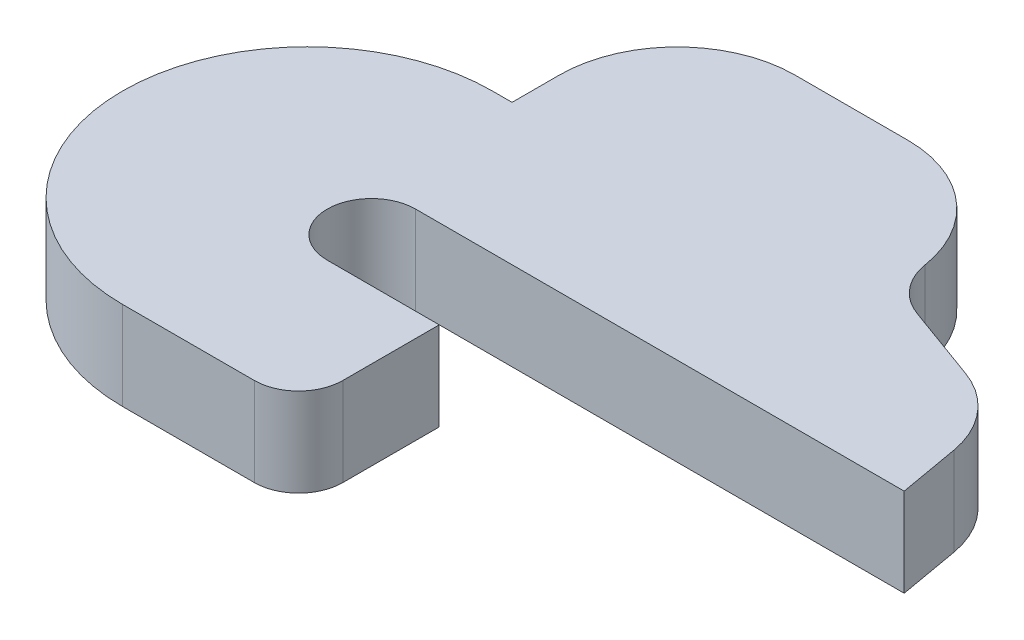
ISO-10303-21;
HEADER;
FILE_DESCRIPTION(('STEP AP214'),'2;1');
FILE_NAME('part.step','',(''),(''),'','','');
FILE_SCHEMA(('AUTOMOTIVE_DESIGN { 1 0 10303 214 1 1 1 1 }'));
ENDSEC;
DATA;
#1=APPLICATION_CONTEXT('core data for automotive mechanical design processes');
#2=APPLICATION_PROTOCOL_DEFINITION('international standard','automotive_design',2000,#1);
#3=PRODUCT_CONTEXT('',#1,'mechanical');
#4=PRODUCT('Part','Part','',(#3));
#5=PRODUCT_RELATED_PRODUCT_CATEGORY('part','',(#4));
#6=PRODUCT_DEFINITION_FORMATION('','',#4);
#7=PRODUCT_DEFINITION_CONTEXT('part definition',#1,'design');
#8=PRODUCT_DEFINITION('design','',#6,#7);
#9=PRODUCT_DEFINITION_SHAPE('','',#8);
#10=(LENGTH_UNIT() NAMED_UNIT(*) SI_UNIT(.MILLI.,.METRE.));
#11=(NAMED_UNIT(*) PLANE_ANGLE_UNIT() SI_UNIT($,.RADIAN.));
#12=(NAMED_UNIT(*) SI_UNIT($,.STERADIAN.) SOLID_ANGLE_UNIT());
#13=UNCERTAINTY_MEASURE_WITH_UNIT(LENGTH_MEASURE(1.E-05),#10,'distance_accuracy_value','');
#14=(GEOMETRIC_REPRESENTATION_CONTEXT(3) GLOBAL_UNCERTAINTY_ASSIGNED_CONTEXT((#13)) GLOBAL_UNIT_ASSIGNED_CONTEXT((#10,
#11,#12)) REPRESENTATION_CONTEXT('',''));
#15=CARTESIAN_POINT('',(0.,0.,0.));
#16=DIRECTION('',(0.,0.,1.));
#17=DIRECTION('',(1.,0.,0.));
#18=AXIS2_PLACEMENT_3D('',#15,#16,#17);
#19=CARTESIAN_POINT('',(0.,3.,3.27));
#20=DIRECTION('',(-1.,0.,0.));
#21=DIRECTION('',(0.,0.,1.));
#22=AXIS2_PLACEMENT_3D('',#19,#20,#21);
#23=PLANE('',#22);
#24=DIRECTION('',(0.,0.,-1.));
#25=VECTOR('',#24,1.);
#26=CARTESIAN_POINT('',(0.,0.,3.27));
#27=LINE('',#26,#25);
#28=CARTESIAN_POINT('',(0.,0.,3.27));
#29=VERTEX_POINT('',#28);
#30=CARTESIAN_POINT('',(0.,0.,0.));
#31=VERTEX_POINT('',#30);
#32=EDGE_CURVE('E177',#29,#31,#27,.T.);
#33=ORIENTED_EDGE('',*,*,#32,.T.);
#34=DIRECTION('',(0.,-1.,0.));
#35=VECTOR('',#34,1.);
#36=CARTESIAN_POINT('',(0.,3.,0.));
#37=LINE('',#36,#35);
#38=CARTESIAN_POINT('',(0.,3.,0.));
#39=VERTEX_POINT('',#38);
#40=EDGE_CURVE('E11',#39,#31,#37,.T.);
#41=ORIENTED_EDGE('',*,*,#40,.F.);
#42=DIRECTION('',(0.,0.,-1.));
#43=VECTOR('',#42,1.);
#44=CARTESIAN_POINT('',(0.,3.,3.27));
#45=LINE('',#44,#43);
#46=CARTESIAN_POINT('',(0.,3.,3.27));
#47=VERTEX_POINT('',#46);
#48=EDGE_CURVE('E207',#47,#39,#45,.T.);
#49=ORIENTED_EDGE('',*,*,#48,.F.);
#50=DIRECTION('',(0.,-1.,0.));
#51=VECTOR('',#50,1.);
#52=CARTESIAN_POINT('',(0.,3.,3.27));
#53=LINE('',#52,#51);
#54=EDGE_CURVE('E173',#47,#29,#53,.T.);
#55=ORIENTED_EDGE('',*,*,#54,.T.);
#56=EDGE_LOOP('',(#33,#41,#49,#55));
#57=FACE_BOUND('',#56,.T.);
#58=ADVANCED_FACE('F33',(#57),#23,.F.);
#59=CARTESIAN_POINT('',(0.,3.,0.));
#60=DIRECTION('',(0.,0.,1.));
#61=DIRECTION('',(1.,0.,0.));
#62=AXIS2_PLACEMENT_3D('',#59,#60,#61);
#63=PLANE('',#62);
#64=DIRECTION('',(-1.,0.,0.));
#65=VECTOR('',#64,1.);
#66=CARTESIAN_POINT('',(0.,0.,0.));
#67=LINE('',#66,#65);
#68=CARTESIAN_POINT('',(-3.8,0.,0.));
#69=VERTEX_POINT('',#68);
#70=EDGE_CURVE('E180',#31,#69,#67,.T.);
#71=ORIENTED_EDGE('',*,*,#70,.T.);
#72=DIRECTION('',(0.,-1.,0.));
#73=VECTOR('',#72,1.);
#74=CARTESIAN_POINT('',(-3.8,3.,0.));
#75=LINE('',#74,#73);
#76=CARTESIAN_POINT('',(-3.8,3.,0.));
#77=VERTEX_POINT('',#76);
#78=EDGE_CURVE('E41',#77,#69,#75,.T.);
#79=ORIENTED_EDGE('',*,*,#78,.F.);
#80=DIRECTION('',(-1.,0.,0.));
#81=VECTOR('',#80,1.);
#82=CARTESIAN_POINT('',(0.,3.,0.));
#83=LINE('',#82,#81);
#84=EDGE_CURVE('E116',#39,#77,#83,.T.);
#85=ORIENTED_EDGE('',*,*,#84,.F.);
#86=ORIENTED_EDGE('',*,*,#40,.T.);
#87=EDGE_LOOP('',(#71,#79,#85,#86));
#88=FACE_BOUND('',#87,.T.);
#89=ADVANCED_FACE('F305',(#88),#63,.F.);
#90=CARTESIAN_POINT('',(-3.8,3.,-1.5));
#91=DIRECTION('',(0.,-1.,0.));
#92=DIRECTION('',(0.,0.,-1.));
#93=AXIS2_PLACEMENT_3D('',#90,#91,#92);
#94=CYLINDRICAL_SURFACE('',#93,1.5);
#95=CARTESIAN_POINT('',(-3.8,0.,-1.5));
#96=DIRECTION('',(0.,-1.,0.));
#97=DIRECTION('',(0.,0.,-1.));
#98=AXIS2_PLACEMENT_3D('',#95,#96,#97);
#99=CIRCLE('',#98,1.5);
#100=CARTESIAN_POINT('',(-3.8,0.,-3.));
#101=VERTEX_POINT('',#100);
#102=EDGE_CURVE('E182',#69,#101,#99,.T.);
#103=ORIENTED_EDGE('',*,*,#102,.T.);
#104=DIRECTION('',(0.,-1.,0.));
#105=VECTOR('',#104,1.);
#106=CARTESIAN_POINT('',(-3.8,3.,-3.));
#107=LINE('',#106,#105);
#108=CARTESIAN_POINT('',(-3.8,3.,-3.));
#109=VERTEX_POINT('',#108);
#110=EDGE_CURVE('E238',#109,#101,#107,.T.);
#111=ORIENTED_EDGE('',*,*,#110,.F.);
#112=CARTESIAN_POINT('',(-3.8,3.,-1.5));
#113=DIRECTION('',(0.,-1.,0.));
#114=DIRECTION('',(0.,0.,-1.));
#115=AXIS2_PLACEMENT_3D('',#112,#113,#114);
#116=CIRCLE('',#115,1.5);
#117=EDGE_CURVE('E246',#77,#109,#116,.T.);
#118=ORIENTED_EDGE('',*,*,#117,.F.);
#119=ORIENTED_EDGE('',*,*,#78,.T.);
#120=EDGE_LOOP('',(#103,#111,#118,#119));
#121=FACE_BOUND('',#120,.T.);
#122=ADVANCED_FACE('F244',(#121),#94,.F.);
#123=CARTESIAN_POINT('',(-3.8,3.,-3.));
#124=DIRECTION('',(0.,0.,-1.));
#125=DIRECTION('',(-1.,0.,0.));
#126=AXIS2_PLACEMENT_3D('',#123,#124,#125);
#127=PLANE('',#126);
#128=DIRECTION('',(1.,0.,0.));
#129=VECTOR('',#128,1.);
#130=CARTESIAN_POINT('',(-3.8,0.,-3.));
#131=LINE('',#130,#129);
#132=CARTESIAN_POINT('',(12.77,0.,-3.));
#133=VERTEX_POINT('',#132);
#134=EDGE_CURVE('E184',#101,#133,#131,.T.);
#135=ORIENTED_EDGE('',*,*,#134,.T.);
#136=DIRECTION('',(0.,-1.,0.));
#137=VECTOR('',#136,1.);
#138=CARTESIAN_POINT('',(12.77,3.,-3.));
#139=LINE('',#138,#137);
#140=CARTESIAN_POINT('',(12.77,3.,-3.));
#141=VERTEX_POINT('',#140);
#142=EDGE_CURVE('E235',#141,#133,#139,.T.);
#143=ORIENTED_EDGE('',*,*,#142,.F.);
#144=DIRECTION('',(1.,0.,0.));
#145=VECTOR('',#144,1.);
#146=CARTESIAN_POINT('',(-3.8,3.,-3.));
#147=LINE('',#146,#145);
#148=EDGE_CURVE('E264',#109,#141,#147,.T.);
#149=ORIENTED_EDGE('',*,*,#148,.F.);
#150=ORIENTED_EDGE('',*,*,#110,.T.);
#151=EDGE_LOOP('',(#135,#143,#149,#150));
#152=FACE_BOUND('',#151,.T.);
#153=ADVANCED_FACE('F255',(#152),#127,.F.);
#154=CARTESIAN_POINT('',(12.77,3.,-3.));
#155=DIRECTION('',(-0.984807753012207,0.,0.173648177666936));
#156=DIRECTION('',(0.173648177666936,0.,0.984807753012207));
#157=AXIS2_PLACEMENT_3D('',#154,#155,#156);
#158=PLANE('',#157);
#159=DIRECTION('',(-0.173648177666936,0.,-0.984807753012207));
#160=VECTOR('',#159,1.);
#161=CARTESIAN_POINT('',(12.77,0.,-3.));
#162=LINE('',#161,#160);
#163=CARTESIAN_POINT('',(12.4088221154867,0.,-5.04834157008812));
#164=VERTEX_POINT('',#163);
#165=EDGE_CURVE('E186',#133,#164,#162,.T.);
#166=ORIENTED_EDGE('',*,*,#165,.T.);
#167=DIRECTION('',(0.,-1.,0.));
#168=VECTOR('',#167,1.);
#169=CARTESIAN_POINT('',(12.4088221154867,3.,-5.04834157008812));
#170=LINE('',#169,#168);
#171=CARTESIAN_POINT('',(12.4088221154867,3.,-5.04834157008812));
#172=VERTEX_POINT('',#171);
#173=EDGE_CURVE('E232',#172,#164,#170,.T.);
#174=ORIENTED_EDGE('',*,*,#173,.F.);
#175=DIRECTION('',(-0.173648177666936,0.,-0.984807753012207));
#176=VECTOR('',#175,1.);
#177=CARTESIAN_POINT('',(12.77,3.,-3.));
#178=LINE('',#177,#176);
#179=EDGE_CURVE('E261',#141,#172,#178,.T.);
#180=ORIENTED_EDGE('',*,*,#179,.F.);
#181=ORIENTED_EDGE('',*,*,#142,.T.);
#182=EDGE_LOOP('',(#166,#174,#180,#181));
#183=FACE_BOUND('',#182,.T.);
#184=ADVANCED_FACE('F259',(#183),#158,.F.);
#185=CARTESIAN_POINT('',(9.25743730584765,3.,-4.49266740155393));
#186=DIRECTION('',(0.,-1.,0.));
#187=DIRECTION('',(0.,0.,-1.));
#188=AXIS2_PLACEMENT_3D('',#185,#186,#187);
#189=CYLINDRICAL_SURFACE('',#188,3.2);
#190=CARTESIAN_POINT('',(9.25743730584765,0.,-4.49266740155393));
#191=DIRECTION('',(0.,1.,0.));
#192=DIRECTION('',(0.,0.,1.));
#193=AXIS2_PLACEMENT_3D('',#190,#191,#192);
#194=CIRCLE('',#193,3.2);
#195=CARTESIAN_POINT('',(10.3510325885385,0.,-7.5));
#196=VERTEX_POINT('',#195);
#197=EDGE_CURVE('E188',#164,#196,#194,.T.);
#198=ORIENTED_EDGE('',*,*,#197,.T.);
#199=DIRECTION('',(0.,-1.,0.));
#200=VECTOR('',#199,1.);
#201=CARTESIAN_POINT('',(10.3510325885385,3.,-7.5));
#202=LINE('',#201,#200);
#203=CARTESIAN_POINT('',(10.3510325885385,3.,-7.5));
#204=VERTEX_POINT('',#203);
#205=EDGE_CURVE('E229',#204,#196,#202,.T.);
#206=ORIENTED_EDGE('',*,*,#205,.F.);
#207=CARTESIAN_POINT('',(9.25743730584765,3.,-4.49266740155393));
#208=DIRECTION('',(0.,1.,0.));
#209=DIRECTION('',(0.,0.,1.));
#210=AXIS2_PLACEMENT_3D('',#207,#208,#209);
#211=CIRCLE('',#210,3.2);
#212=EDGE_CURVE('E263',#172,#204,#211,.T.);
#213=ORIENTED_EDGE('',*,*,#212,.F.);
#214=ORIENTED_EDGE('',*,*,#173,.T.);
#215=EDGE_LOOP('',(#198,#206,#213,#214));
#216=FACE_BOUND('',#215,.T.);
#217=ADVANCED_FACE('F318',(#216),#189,.T.);
#218=CARTESIAN_POINT('',(7.77,3.,-8.43857429163487));
#219=DIRECTION('',(-0.341748525840883,0.,0.939791437014396));
#220=DIRECTION('',(0.939791437014396,0.,0.341748525840883));
#221=AXIS2_PLACEMENT_3D('',#218,#219,#220);
#222=PLANE('',#221);
#223=DIRECTION('',(-0.939791437014396,0.,-0.341748525840883));
#224=VECTOR('',#223,1.);
#225=CARTESIAN_POINT('',(7.77,0.,-8.43857429163487));
#226=LINE('',#225,#224);
#227=CARTESIAN_POINT('',(7.77,0.,-8.43857429163487));
#228=VERTEX_POINT('',#227);
#229=EDGE_CURVE('E190',#196,#228,#226,.T.);
#230=ORIENTED_EDGE('',*,*,#229,.T.);
#231=DIRECTION('',(0.,-1.,0.));
#232=VECTOR('',#231,1.);
#233=CARTESIAN_POINT('',(7.77,3.,-8.43857429163487));
#234=LINE('',#233,#232);
#235=CARTESIAN_POINT('',(7.77,3.,-8.43857429163487));
#236=VERTEX_POINT('',#235);
#237=EDGE_CURVE('E226',#236,#228,#234,.T.);
#238=ORIENTED_EDGE('',*,*,#237,.F.);
#239=DIRECTION('',(-0.939791437014396,0.,-0.341748525840883));
#240=VECTOR('',#239,1.);
#241=CARTESIAN_POINT('',(7.77,3.,-8.43857429163487));
#242=LINE('',#241,#240);
#243=EDGE_CURVE('E266',#204,#236,#242,.T.);
#244=ORIENTED_EDGE('',*,*,#243,.F.);
#245=ORIENTED_EDGE('',*,*,#205,.T.);
#246=EDGE_LOOP('',(#230,#238,#244,#245));
#247=FACE_BOUND('',#246,.T.);
#248=ADVANCED_FACE('F321',(#247),#222,.F.);
#249=CARTESIAN_POINT('',(8.45349705168176,3.,-10.3181571656637));
#250=DIRECTION('',(0.,-1.,0.));
#251=DIRECTION('',(0.,0.,-1.));
#252=AXIS2_PLACEMENT_3D('',#249,#250,#251);
#253=CYLINDRICAL_SURFACE('',#252,2.);
#254=CARTESIAN_POINT('',(8.45349705168176,0.,-10.3181571656637));
#255=DIRECTION('',(0.,-1.,0.));
#256=DIRECTION('',(0.,0.,-1.));
#257=AXIS2_PLACEMENT_3D('',#254,#255,#256);
#258=CIRCLE('',#257,2.);
#259=CARTESIAN_POINT('',(6.47862721098619,0.,-10.0021047771091));
#260=VERTEX_POINT('',#259);
#261=EDGE_CURVE('E192',#228,#260,#258,.T.);
#262=ORIENTED_EDGE('',*,*,#261,.T.);
#263=DIRECTION('',(0.,-1.,0.));
#264=VECTOR('',#263,1.);
#265=CARTESIAN_POINT('',(6.47862721098619,3.,-10.0021047771091));
#266=LINE('',#265,#264);
#267=CARTESIAN_POINT('',(6.47862721098619,3.,-10.0021047771091));
#268=VERTEX_POINT('',#267);
#269=EDGE_CURVE('E223',#268,#260,#266,.T.);
#270=ORIENTED_EDGE('',*,*,#269,.F.);
#271=CARTESIAN_POINT('',(8.45349705168176,3.,-10.3181571656637));
#272=DIRECTION('',(0.,-1.,0.));
#273=DIRECTION('',(0.,0.,-1.));
#274=AXIS2_PLACEMENT_3D('',#271,#272,#273);
#275=CIRCLE('',#274,2.);
#276=EDGE_CURVE('E272',#236,#268,#275,.T.);
#277=ORIENTED_EDGE('',*,*,#276,.F.);
#278=ORIENTED_EDGE('',*,*,#237,.T.);
#279=EDGE_LOOP('',(#262,#270,#277,#278));
#280=FACE_BOUND('',#279,.T.);
#281=ADVANCED_FACE('F325',(#280),#253,.F.);
#282=CARTESIAN_POINT('',(2.52888752959504,3.,-9.37));
#283=DIRECTION('',(0.,-1.,0.));
#284=DIRECTION('',(0.,0.,-1.));
#285=AXIS2_PLACEMENT_3D('',#282,#283,#284);
#286=CYLINDRICAL_SURFACE('',#285,4.);
#287=CARTESIAN_POINT('',(2.52888752959504,0.,-9.37));
#288=DIRECTION('',(0.,1.,0.));
#289=DIRECTION('',(0.,0.,-1.));
#290=AXIS2_PLACEMENT_3D('',#287,#288,#289);
#291=CIRCLE('',#290,4.);
#292=CARTESIAN_POINT('',(2.52888752959504,0.,-13.37));
#293=VERTEX_POINT('',#292);
#294=EDGE_CURVE('E194',#260,#293,#291,.T.);
#295=ORIENTED_EDGE('',*,*,#294,.T.);
#296=DIRECTION('',(0.,-1.,0.));
#297=VECTOR('',#296,1.);
#298=CARTESIAN_POINT('',(2.52888752959504,3.,-13.37));
#299=LINE('',#298,#297);
#300=CARTESIAN_POINT('',(2.52888752959504,3.,-13.37));
#301=VERTEX_POINT('',#300);
#302=EDGE_CURVE('E220',#301,#293,#299,.T.);
#303=ORIENTED_EDGE('',*,*,#302,.F.);
#304=CARTESIAN_POINT('',(2.52888752959504,3.,-9.37));
#305=DIRECTION('',(0.,1.,0.));
#306=DIRECTION('',(0.,0.,-1.));
#307=AXIS2_PLACEMENT_3D('',#304,#305,#306);
#308=CIRCLE('',#307,4.);
#309=EDGE_CURVE('E274',#268,#301,#308,.T.);
#310=ORIENTED_EDGE('',*,*,#309,.F.);
#311=ORIENTED_EDGE('',*,*,#269,.T.);
#312=EDGE_LOOP('',(#295,#303,#310,#311));
#313=FACE_BOUND('',#312,.T.);
#314=ADVANCED_FACE('F329',(#313),#286,.T.);
#315=CARTESIAN_POINT('',(2.52888752959504,3.,-13.37));
#316=DIRECTION('',(0.,0.,1.));
#317=DIRECTION('',(1.,0.,0.));
#318=AXIS2_PLACEMENT_3D('',#315,#316,#317);
#319=PLANE('',#318);
#320=DIRECTION('',(-1.,0.,0.));
#321=VECTOR('',#320,1.);
#322=CARTESIAN_POINT('',(2.52888752959504,0.,-13.37));
#323=LINE('',#322,#321);
#324=CARTESIAN_POINT('',(-1.3,0.,-13.37));
#325=VERTEX_POINT('',#324);
#326=EDGE_CURVE('E196',#293,#325,#323,.T.);
#327=ORIENTED_EDGE('',*,*,#326,.T.);
#328=DIRECTION('',(0.,-1.,0.));
#329=VECTOR('',#328,1.);
#330=CARTESIAN_POINT('',(-1.3,3.,-13.37));
#331=LINE('',#330,#329);
#332=CARTESIAN_POINT('',(-1.3,3.,-13.37));
#333=VERTEX_POINT('',#332);
#334=EDGE_CURVE('E217',#333,#325,#331,.T.);
#335=ORIENTED_EDGE('',*,*,#334,.F.);
#336=DIRECTION('',(-1.,0.,0.));
#337=VECTOR('',#336,1.);
#338=CARTESIAN_POINT('',(2.52888752959504,3.,-13.37));
#339=LINE('',#338,#337);
#340=EDGE_CURVE('E276',#301,#333,#339,.T.);
#341=ORIENTED_EDGE('',*,*,#340,.F.);
#342=ORIENTED_EDGE('',*,*,#302,.T.);
#343=EDGE_LOOP('',(#327,#335,#341,#342));
#344=FACE_BOUND('',#343,.T.);
#345=ADVANCED_FACE('F333',(#344),#319,.F.);
#346=CARTESIAN_POINT('',(-1.3,3.,-9.37));
#347=DIRECTION('',(0.,-1.,0.));
#348=DIRECTION('',(0.,0.,-1.));
#349=AXIS2_PLACEMENT_3D('',#346,#347,#348);
#350=CYLINDRICAL_SURFACE('',#349,4.);
#351=CARTESIAN_POINT('',(-1.3,0.,-9.37));
#352=DIRECTION('',(0.,1.,0.));
#353=DIRECTION('',(0.,0.,1.));
#354=AXIS2_PLACEMENT_3D('',#351,#352,#353);
#355=CIRCLE('',#354,4.);
#356=CARTESIAN_POINT('',(-5.3,0.,-9.37));
#357=VERTEX_POINT('',#356);
#358=EDGE_CURVE('E198',#325,#357,#355,.T.);
#359=ORIENTED_EDGE('',*,*,#358,.T.);
#360=DIRECTION('',(0.,-1.,0.));
#361=VECTOR('',#360,1.);
#362=CARTESIAN_POINT('',(-5.3,3.,-9.37));
#363=LINE('',#362,#361);
#364=CARTESIAN_POINT('',(-5.3,3.,-9.37));
#365=VERTEX_POINT('',#364);
#366=EDGE_CURVE('E214',#365,#357,#363,.T.);
#367=ORIENTED_EDGE('',*,*,#366,.F.);
#368=CARTESIAN_POINT('',(-1.3,3.,-9.37));
#369=DIRECTION('',(0.,1.,0.));
#370=DIRECTION('',(0.,0.,1.));
#371=AXIS2_PLACEMENT_3D('',#368,#369,#370);
#372=CIRCLE('',#371,4.);
#373=EDGE_CURVE('E278',#333,#365,#372,.T.);
#374=ORIENTED_EDGE('',*,*,#373,.F.);
#375=ORIENTED_EDGE('',*,*,#334,.T.);
#376=EDGE_LOOP('',(#359,#367,#374,#375));
#377=FACE_BOUND('',#376,.T.);
#378=ADVANCED_FACE('F337',(#377),#350,.T.);
#379=CARTESIAN_POINT('',(-5.3,3.,-9.37));
#380=DIRECTION('',(1.,0.,0.));
#381=DIRECTION('',(0.,0.,-1.));
#382=AXIS2_PLACEMENT_3D('',#379,#380,#381);
#383=PLANE('',#382);
#384=DIRECTION('',(0.,0.,1.));
#385=VECTOR('',#384,1.);
#386=CARTESIAN_POINT('',(-5.3,0.,-9.37));
#387=LINE('',#386,#385);
#388=CARTESIAN_POINT('',(-5.3,0.,-7.77));
#389=VERTEX_POINT('',#388);
#390=EDGE_CURVE('E200',#357,#389,#387,.T.);
#391=ORIENTED_EDGE('',*,*,#390,.T.);
#392=DIRECTION('',(0.,-1.,0.));
#393=VECTOR('',#392,1.);
#394=CARTESIAN_POINT('',(-5.3,3.,-7.77));
#395=LINE('',#394,#393);
#396=CARTESIAN_POINT('',(-5.3,3.,-7.77));
#397=VERTEX_POINT('',#396);
#398=EDGE_CURVE('E211',#397,#389,#395,.T.);
#399=ORIENTED_EDGE('',*,*,#398,.F.);
#400=DIRECTION('',(0.,0.,1.));
#401=VECTOR('',#400,1.);
#402=CARTESIAN_POINT('',(-5.3,3.,-9.37));
#403=LINE('',#402,#401);
#404=EDGE_CURVE('E280',#365,#397,#403,.T.);
#405=ORIENTED_EDGE('',*,*,#404,.F.);
#406=ORIENTED_EDGE('',*,*,#366,.T.);
#407=EDGE_LOOP('',(#391,#399,#405,#406));
#408=FACE_BOUND('',#407,.T.);
#409=ADVANCED_FACE('F286',(#408),#383,.F.);
#410=CARTESIAN_POINT('',(-5.3,3.,-7.77));
#411=DIRECTION('',(0.,0.,1.));
#412=DIRECTION('',(1.,0.,0.));
#413=AXIS2_PLACEMENT_3D('',#410,#411,#412);
#414=PLANE('',#413);
#415=DIRECTION('',(-1.,0.,0.));
#416=VECTOR('',#415,1.);
#417=CARTESIAN_POINT('',(-5.3,0.,-7.77));
#418=LINE('',#417,#416);
#419=CARTESIAN_POINT('',(-5.97,0.,-7.77));
#420=VERTEX_POINT('',#419);
#421=EDGE_CURVE('E202',#389,#420,#418,.T.);
#422=ORIENTED_EDGE('',*,*,#421,.T.);
#423=DIRECTION('',(0.,-1.,0.));
#424=VECTOR('',#423,1.);
#425=CARTESIAN_POINT('',(-5.97,3.,-7.77));
#426=LINE('',#425,#424);
#427=CARTESIAN_POINT('',(-5.97,3.,-7.77));
#428=VERTEX_POINT('',#427);
#429=EDGE_CURVE('E168',#428,#420,#426,.T.);
#430=ORIENTED_EDGE('',*,*,#429,.F.);
#431=DIRECTION('',(-1.,0.,0.));
#432=VECTOR('',#431,1.);
#433=CARTESIAN_POINT('',(-5.3,3.,-7.77));
#434=LINE('',#433,#432);
#435=EDGE_CURVE('E159',#397,#428,#434,.T.);
#436=ORIENTED_EDGE('',*,*,#435,.F.);
#437=ORIENTED_EDGE('',*,*,#398,.T.);
#438=EDGE_LOOP('',(#422,#430,#436,#437));
#439=FACE_BOUND('',#438,.T.);
#440=ADVANCED_FACE('F290',(#439),#414,.F.);
#441=CARTESIAN_POINT('',(-5.97,3.,-1.5));
#442=DIRECTION('',(0.,-1.,0.));
#443=DIRECTION('',(0.,0.,-1.));
#444=AXIS2_PLACEMENT_3D('',#441,#442,#443);
#445=CYLINDRICAL_SURFACE('',#444,6.27);
#446=CARTESIAN_POINT('',(-5.97,0.,-1.5));
#447=DIRECTION('',(0.,1.,0.));
#448=DIRECTION('',(0.,0.,1.));
#449=AXIS2_PLACEMENT_3D('',#446,#447,#448);
#450=CIRCLE('',#449,6.27);
#451=CARTESIAN_POINT('',(-5.97,0.,4.77));
#452=VERTEX_POINT('',#451);
#453=EDGE_CURVE('E167',#420,#452,#450,.T.);
#454=ORIENTED_EDGE('',*,*,#453,.T.);
#455=DIRECTION('',(0.,-1.,0.));
#456=VECTOR('',#455,1.);
#457=CARTESIAN_POINT('',(-5.97,3.,4.77));
#458=LINE('',#457,#456);
#459=CARTESIAN_POINT('',(-5.97,3.,4.77));
#460=VERTEX_POINT('',#459);
#461=EDGE_CURVE('E164',#460,#452,#458,.T.);
#462=ORIENTED_EDGE('',*,*,#461,.F.);
#463=CARTESIAN_POINT('',(-5.97,3.,-1.5));
#464=DIRECTION('',(0.,1.,0.));
#465=DIRECTION('',(0.,0.,1.));
#466=AXIS2_PLACEMENT_3D('',#463,#464,#465);
#467=CIRCLE('',#466,6.27);
#468=EDGE_CURVE('E153',#428,#460,#467,.T.);
#469=ORIENTED_EDGE('',*,*,#468,.F.);
#470=ORIENTED_EDGE('',*,*,#429,.T.);
#471=EDGE_LOOP('',(#454,#462,#469,#470));
#472=FACE_BOUND('',#471,.T.);
#473=ADVANCED_FACE('F165',(#472),#445,.T.);
#474=CARTESIAN_POINT('',(-5.97,3.,4.77));
#475=DIRECTION('',(0.,0.,-1.));
#476=DIRECTION('',(-1.,0.,0.));
#477=AXIS2_PLACEMENT_3D('',#474,#475,#476);
#478=PLANE('',#477);
#479=DIRECTION('',(1.,0.,0.));
#480=VECTOR('',#479,1.);
#481=CARTESIAN_POINT('',(-5.97,0.,4.77));
#482=LINE('',#481,#480);
#483=CARTESIAN_POINT('',(-1.5,0.,4.77));
#484=VERTEX_POINT('',#483);
#485=EDGE_CURVE('E102',#452,#484,#482,.T.);
#486=ORIENTED_EDGE('',*,*,#485,.T.);
#487=DIRECTION('',(0.,-1.,0.));
#488=VECTOR('',#487,1.);
#489=CARTESIAN_POINT('',(-1.5,3.,4.77));
#490=LINE('',#489,#488);
#491=CARTESIAN_POINT('',(-1.5,3.,4.77));
#492=VERTEX_POINT('',#491);
#493=EDGE_CURVE('E169',#492,#484,#490,.T.);
#494=ORIENTED_EDGE('',*,*,#493,.F.);
#495=DIRECTION('',(1.,0.,0.));
#496=VECTOR('',#495,1.);
#497=CARTESIAN_POINT('',(-5.97,3.,4.77));
#498=LINE('',#497,#496);
#499=EDGE_CURVE('E157',#460,#492,#498,.T.);
#500=ORIENTED_EDGE('',*,*,#499,.F.);
#501=ORIENTED_EDGE('',*,*,#461,.T.);
#502=EDGE_LOOP('',(#486,#494,#500,#501));
#503=FACE_BOUND('',#502,.T.);
#504=ADVANCED_FACE('F171',(#503),#478,.F.);
#505=CARTESIAN_POINT('',(-1.5,3.,3.27));
#506=DIRECTION('',(0.,-1.,0.));
#507=DIRECTION('',(0.,0.,-1.));
#508=AXIS2_PLACEMENT_3D('',#505,#506,#507);
#509=CYLINDRICAL_SURFACE('',#508,1.5);
#510=CARTESIAN_POINT('',(-1.5,0.,3.27));
#511=DIRECTION('',(0.,1.,0.));
#512=DIRECTION('',(0.,0.,1.));
#513=AXIS2_PLACEMENT_3D('',#510,#511,#512);
#514=CIRCLE('',#513,1.5);
#515=EDGE_CURVE('E108',#484,#29,#514,.T.);
#516=ORIENTED_EDGE('',*,*,#515,.T.);
#517=ORIENTED_EDGE('',*,*,#54,.F.);
#518=CARTESIAN_POINT('',(-1.5,3.,3.27));
#519=DIRECTION('',(0.,1.,0.));
#520=DIRECTION('',(0.,0.,1.));
#521=AXIS2_PLACEMENT_3D('',#518,#519,#520);
#522=CIRCLE('',#521,1.5);
#523=EDGE_CURVE('E49',#492,#47,#522,.T.);
#524=ORIENTED_EDGE('',*,*,#523,.F.);
#525=ORIENTED_EDGE('',*,*,#493,.T.);
#526=EDGE_LOOP('',(#516,#517,#524,#525));
#527=FACE_BOUND('',#526,.T.);
#528=ADVANCED_FACE('F294',(#527),#509,.T.);
#529=CARTESIAN_POINT('',(-3.8,3.,-1.5));
#530=DIRECTION('',(0.,-1.,0.));
#531=DIRECTION('',(0.,0.,-1.));
#532=AXIS2_PLACEMENT_3D('',#529,#530,#531);
#533=PLANE('',#532);
#534=ORIENTED_EDGE('',*,*,#48,.T.);
#535=ORIENTED_EDGE('',*,*,#84,.T.);
#536=ORIENTED_EDGE('',*,*,#117,.T.);
#537=ORIENTED_EDGE('',*,*,#148,.T.);
#538=ORIENTED_EDGE('',*,*,#179,.T.);
#539=ORIENTED_EDGE('',*,*,#212,.T.);
#540=ORIENTED_EDGE('',*,*,#243,.T.);
#541=ORIENTED_EDGE('',*,*,#276,.T.);
#542=ORIENTED_EDGE('',*,*,#309,.T.);
#543=ORIENTED_EDGE('',*,*,#340,.T.);
#544=ORIENTED_EDGE('',*,*,#373,.T.);
#545=ORIENTED_EDGE('',*,*,#404,.T.);
#546=ORIENTED_EDGE('',*,*,#435,.T.);
#547=ORIENTED_EDGE('',*,*,#468,.T.);
#548=ORIENTED_EDGE('',*,*,#499,.T.);
#549=ORIENTED_EDGE('',*,*,#523,.T.);
#550=EDGE_LOOP('',(#534,#535,#536,#537,#538,#539,#540,#541,#542,#543,#544,#545,#546,#547,#548,#549));
#551=FACE_BOUND('',#550,.T.);
#552=ADVANCED_FACE('F155',(#551),#533,.F.);
#553=CARTESIAN_POINT('',(-3.8,0.,-1.5));
#554=DIRECTION('',(0.,-1.,0.));
#555=DIRECTION('',(0.,0.,-1.));
#556=AXIS2_PLACEMENT_3D('',#553,#554,#555);
#557=PLANE('',#556);
#558=ORIENTED_EDGE('',*,*,#32,.F.);
#559=ORIENTED_EDGE('',*,*,#515,.F.);
#560=ORIENTED_EDGE('',*,*,#485,.F.);
#561=ORIENTED_EDGE('',*,*,#453,.F.);
#562=ORIENTED_EDGE('',*,*,#421,.F.);
#563=ORIENTED_EDGE('',*,*,#390,.F.);
#564=ORIENTED_EDGE('',*,*,#358,.F.);
#565=ORIENTED_EDGE('',*,*,#326,.F.);
#566=ORIENTED_EDGE('',*,*,#294,.F.);
#567=ORIENTED_EDGE('',*,*,#261,.F.);
#568=ORIENTED_EDGE('',*,*,#229,.F.);
#569=ORIENTED_EDGE('',*,*,#197,.F.);
#570=ORIENTED_EDGE('',*,*,#165,.F.);
#571=ORIENTED_EDGE('',*,*,#134,.F.);
#572=ORIENTED_EDGE('',*,*,#102,.F.);
#573=ORIENTED_EDGE('',*,*,#70,.F.);
#574=EDGE_LOOP('',(#558,#559,#560,#561,#562,#563,#564,#565,#566,#567,#568,#569,#570,#571,#572,#573));
#575=FACE_BOUND('',#574,.T.);
#576=ADVANCED_FACE('F250',(#575),#557,.T.);
#577=CLOSED_SHELL('',(#58,#89,#122,#153,#184,#217,#248,#281,#314,#345,#378,#409,#440,#473,#504,
#528,#552,#576));
#578=MANIFOLD_SOLID_BREP('B2',#577);
#579=ADVANCED_BREP_SHAPE_REPRESENTATION('',(#18,#578),#14);
#580=SHAPE_DEFINITION_REPRESENTATION(#9,#579);
ENDSEC;
END-ISO-10303-21;
